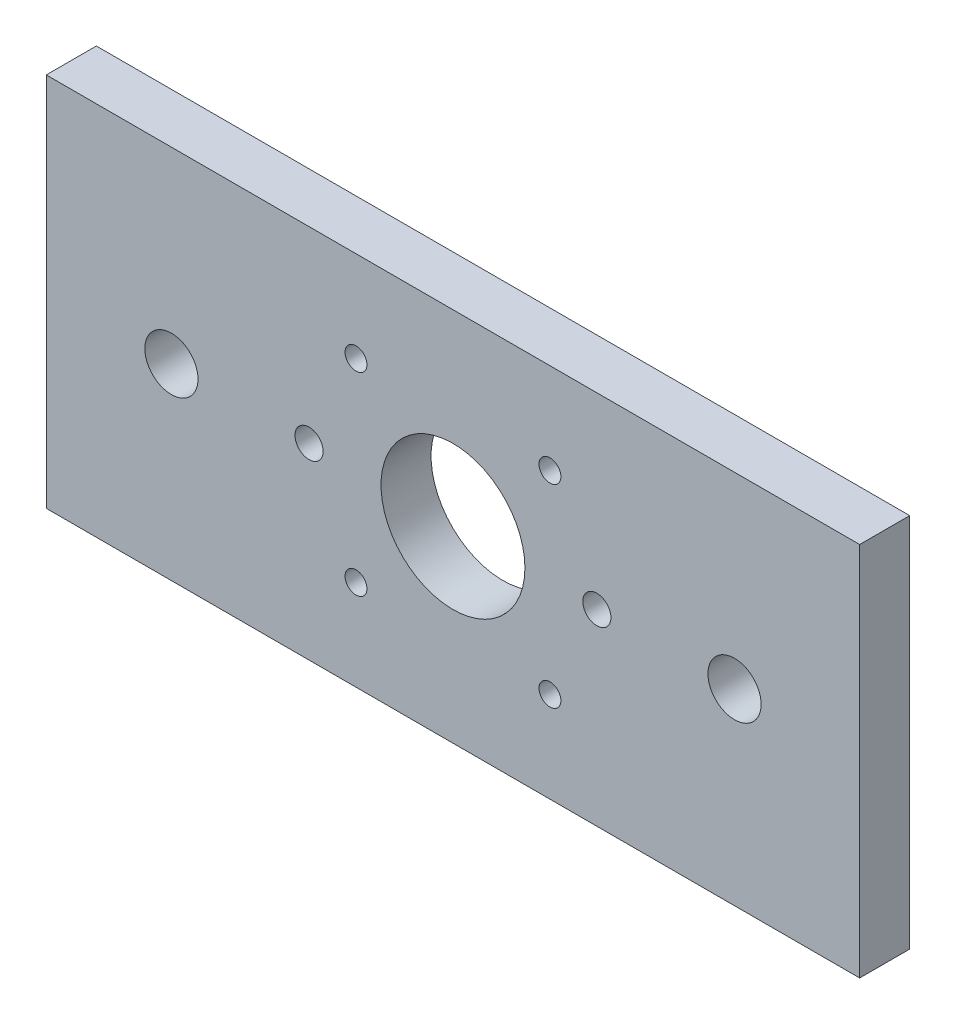
ISO-10303-21;
HEADER;
FILE_DESCRIPTION(('STEP AP214'),'2;1');
FILE_NAME('part.step','',(''),(''),'','','');
FILE_SCHEMA(('AUTOMOTIVE_DESIGN { 1 0 10303 214 1 1 1 1 }'));
ENDSEC;
DATA;
#1=APPLICATION_CONTEXT('core data for automotive mechanical design processes');
#2=APPLICATION_PROTOCOL_DEFINITION('international standard','automotive_design',2000,#1);
#3=PRODUCT_CONTEXT('',#1,'mechanical');
#4=PRODUCT('Part','Part','',(#3));
#5=PRODUCT_RELATED_PRODUCT_CATEGORY('part','',(#4));
#6=PRODUCT_DEFINITION_FORMATION('','',#4);
#7=PRODUCT_DEFINITION_CONTEXT('part definition',#1,'design');
#8=PRODUCT_DEFINITION('design','',#6,#7);
#9=PRODUCT_DEFINITION_SHAPE('','',#8);
#10=(LENGTH_UNIT() NAMED_UNIT(*) SI_UNIT(.MILLI.,.METRE.));
#11=(NAMED_UNIT(*) PLANE_ANGLE_UNIT() SI_UNIT($,.RADIAN.));
#12=(NAMED_UNIT(*) SI_UNIT($,.STERADIAN.) SOLID_ANGLE_UNIT());
#13=UNCERTAINTY_MEASURE_WITH_UNIT(LENGTH_MEASURE(1.E-05),#10,'distance_accuracy_value','');
#14=(GEOMETRIC_REPRESENTATION_CONTEXT(3) GLOBAL_UNCERTAINTY_ASSIGNED_CONTEXT((#13)) GLOBAL_UNIT_ASSIGNED_CONTEXT((#10,
#11,#12)) REPRESENTATION_CONTEXT('',''));
#15=CARTESIAN_POINT('',(0.,0.,0.));
#16=DIRECTION('',(0.,0.,1.));
#17=DIRECTION('',(1.,0.,0.));
#18=AXIS2_PLACEMENT_3D('',#15,#16,#17);
#19=CARTESIAN_POINT('',(15.5,15.5,-1.));
#20=DIRECTION('',(0.,0.,1.));
#21=DIRECTION('',(1.,0.,0.));
#22=AXIS2_PLACEMENT_3D('',#19,#20,#21);
#23=CYLINDRICAL_SURFACE('',#22,1.75);
#24=CARTESIAN_POINT('',(15.5,15.5,8.));
#25=DIRECTION('',(0.,0.,1.));
#26=DIRECTION('',(1.,0.,0.));
#27=AXIS2_PLACEMENT_3D('',#24,#25,#26);
#28=CIRCLE('',#27,1.75);
#29=CARTESIAN_POINT('',(17.25,15.5,8.));
#30=VERTEX_POINT('',#29);
#31=EDGE_CURVE('E147',#30,#30,#28,.T.);
#32=ORIENTED_EDGE('',*,*,#31,.T.);
#33=EDGE_LOOP('',(#32));
#34=FACE_BOUND('',#33,.T.);
#35=CARTESIAN_POINT('',(15.5,15.5,0.));
#36=DIRECTION('',(0.,0.,1.));
#37=DIRECTION('',(1.,0.,0.));
#38=AXIS2_PLACEMENT_3D('',#35,#36,#37);
#39=CIRCLE('',#38,1.75);
#40=CARTESIAN_POINT('',(17.25,15.5,0.));
#41=VERTEX_POINT('',#40);
#42=EDGE_CURVE('E10',#41,#41,#39,.T.);
#43=ORIENTED_EDGE('',*,*,#42,.F.);
#44=EDGE_LOOP('',(#43));
#45=FACE_BOUND('',#44,.T.);
#46=ADVANCED_FACE('F16',(#34,#45),#23,.F.);
#47=CARTESIAN_POINT('',(45.,0.,-1.));
#48=DIRECTION('',(0.,0.,1.));
#49=DIRECTION('',(1.,0.,0.));
#50=AXIS2_PLACEMENT_3D('',#47,#48,#49);
#51=CYLINDRICAL_SURFACE('',#50,4.25);
#52=CARTESIAN_POINT('',(45.,0.,8.));
#53=DIRECTION('',(0.,0.,1.));
#54=DIRECTION('',(1.,0.,0.));
#55=AXIS2_PLACEMENT_3D('',#52,#53,#54);
#56=CIRCLE('',#55,4.25);
#57=CARTESIAN_POINT('',(49.25,0.,8.));
#58=VERTEX_POINT('',#57);
#59=EDGE_CURVE('E137',#58,#58,#56,.T.);
#60=ORIENTED_EDGE('',*,*,#59,.T.);
#61=EDGE_LOOP('',(#60));
#62=FACE_BOUND('',#61,.T.);
#63=CARTESIAN_POINT('',(45.,0.,0.));
#64=DIRECTION('',(0.,0.,1.));
#65=DIRECTION('',(1.,0.,0.));
#66=AXIS2_PLACEMENT_3D('',#63,#64,#65);
#67=CIRCLE('',#66,4.25);
#68=CARTESIAN_POINT('',(49.25,0.,0.));
#69=VERTEX_POINT('',#68);
#70=EDGE_CURVE('E24',#69,#69,#67,.T.);
#71=ORIENTED_EDGE('',*,*,#70,.F.);
#72=EDGE_LOOP('',(#71));
#73=FACE_BOUND('',#72,.T.);
#74=ADVANCED_FACE('F192',(#62,#73),#51,.F.);
#75=CARTESIAN_POINT('',(23.,0.,-1.));
#76=DIRECTION('',(0.,0.,1.));
#77=DIRECTION('',(1.,0.,0.));
#78=AXIS2_PLACEMENT_3D('',#75,#76,#77);
#79=CYLINDRICAL_SURFACE('',#78,2.25);
#80=CARTESIAN_POINT('',(23.,0.,8.));
#81=DIRECTION('',(0.,0.,1.));
#82=DIRECTION('',(1.,0.,0.));
#83=AXIS2_PLACEMENT_3D('',#80,#81,#82);
#84=CIRCLE('',#83,2.25);
#85=CARTESIAN_POINT('',(25.25,0.,8.));
#86=VERTEX_POINT('',#85);
#87=EDGE_CURVE('E124',#86,#86,#84,.T.);
#88=ORIENTED_EDGE('',*,*,#87,.T.);
#89=EDGE_LOOP('',(#88));
#90=FACE_BOUND('',#89,.T.);
#91=CARTESIAN_POINT('',(23.,0.,0.));
#92=DIRECTION('',(0.,0.,1.));
#93=DIRECTION('',(1.,0.,0.));
#94=AXIS2_PLACEMENT_3D('',#91,#92,#93);
#95=CIRCLE('',#94,2.25);
#96=CARTESIAN_POINT('',(25.25,0.,0.));
#97=VERTEX_POINT('',#96);
#98=EDGE_CURVE('E181',#97,#97,#95,.T.);
#99=ORIENTED_EDGE('',*,*,#98,.F.);
#100=EDGE_LOOP('',(#99));
#101=FACE_BOUND('',#100,.T.);
#102=ADVANCED_FACE('F194',(#90,#101),#79,.F.);
#103=CARTESIAN_POINT('',(-15.5,15.5,-1.));
#104=DIRECTION('',(0.,0.,1.));
#105=DIRECTION('',(1.,0.,0.));
#106=AXIS2_PLACEMENT_3D('',#103,#104,#105);
#107=CYLINDRICAL_SURFACE('',#106,1.75);
#108=CARTESIAN_POINT('',(-15.5,15.5,8.));
#109=DIRECTION('',(0.,0.,1.));
#110=DIRECTION('',(1.,0.,0.));
#111=AXIS2_PLACEMENT_3D('',#108,#109,#110);
#112=CIRCLE('',#111,1.75);
#113=CARTESIAN_POINT('',(-13.75,15.5,8.));
#114=VERTEX_POINT('',#113);
#115=EDGE_CURVE('E107',#114,#114,#112,.T.);
#116=ORIENTED_EDGE('',*,*,#115,.T.);
#117=EDGE_LOOP('',(#116));
#118=FACE_BOUND('',#117,.T.);
#119=CARTESIAN_POINT('',(-15.5,15.5,0.));
#120=DIRECTION('',(0.,0.,1.));
#121=DIRECTION('',(1.,0.,0.));
#122=AXIS2_PLACEMENT_3D('',#119,#120,#121);
#123=CIRCLE('',#122,1.75);
#124=CARTESIAN_POINT('',(-13.75,15.5,0.));
#125=VERTEX_POINT('',#124);
#126=EDGE_CURVE('E177',#125,#125,#123,.T.);
#127=ORIENTED_EDGE('',*,*,#126,.F.);
#128=EDGE_LOOP('',(#127));
#129=FACE_BOUND('',#128,.T.);
#130=ADVANCED_FACE('F201',(#118,#129),#107,.F.);
#131=CARTESIAN_POINT('',(0.,0.,-1.));
#132=DIRECTION('',(0.,0.,1.));
#133=DIRECTION('',(1.,0.,0.));
#134=AXIS2_PLACEMENT_3D('',#131,#132,#133);
#135=CYLINDRICAL_SURFACE('',#134,11.5);
#136=CARTESIAN_POINT('',(0.,0.,8.));
#137=DIRECTION('',(0.,0.,1.));
#138=DIRECTION('',(1.,0.,0.));
#139=AXIS2_PLACEMENT_3D('',#136,#137,#138);
#140=CIRCLE('',#139,11.5);
#141=CARTESIAN_POINT('',(11.5,0.,8.));
#142=VERTEX_POINT('',#141);
#143=EDGE_CURVE('E105',#142,#142,#140,.T.);
#144=ORIENTED_EDGE('',*,*,#143,.T.);
#145=EDGE_LOOP('',(#144));
#146=FACE_BOUND('',#145,.T.);
#147=CARTESIAN_POINT('',(0.,0.,0.));
#148=DIRECTION('',(0.,0.,1.));
#149=DIRECTION('',(1.,0.,0.));
#150=AXIS2_PLACEMENT_3D('',#147,#148,#149);
#151=CIRCLE('',#150,11.5);
#152=CARTESIAN_POINT('',(11.5,0.,0.));
#153=VERTEX_POINT('',#152);
#154=EDGE_CURVE('E173',#153,#153,#151,.T.);
#155=ORIENTED_EDGE('',*,*,#154,.F.);
#156=EDGE_LOOP('',(#155));
#157=FACE_BOUND('',#156,.T.);
#158=ADVANCED_FACE('F208',(#146,#157),#135,.F.);
#159=CARTESIAN_POINT('',(-23.,0.,-1.));
#160=DIRECTION('',(0.,0.,1.));
#161=DIRECTION('',(1.,0.,0.));
#162=AXIS2_PLACEMENT_3D('',#159,#160,#161);
#163=CYLINDRICAL_SURFACE('',#162,2.25);
#164=CARTESIAN_POINT('',(-23.,0.,8.));
#165=DIRECTION('',(0.,0.,1.));
#166=DIRECTION('',(1.,0.,0.));
#167=AXIS2_PLACEMENT_3D('',#164,#165,#166);
#168=CIRCLE('',#167,2.25);
#169=CARTESIAN_POINT('',(-20.75,0.,8.));
#170=VERTEX_POINT('',#169);
#171=EDGE_CURVE('E108',#170,#170,#168,.T.);
#172=ORIENTED_EDGE('',*,*,#171,.T.);
#173=EDGE_LOOP('',(#172));
#174=FACE_BOUND('',#173,.T.);
#175=CARTESIAN_POINT('',(-23.,0.,0.));
#176=DIRECTION('',(0.,0.,1.));
#177=DIRECTION('',(1.,0.,0.));
#178=AXIS2_PLACEMENT_3D('',#175,#176,#177);
#179=CIRCLE('',#178,2.25);
#180=CARTESIAN_POINT('',(-20.75,0.,0.));
#181=VERTEX_POINT('',#180);
#182=EDGE_CURVE('E169',#181,#181,#179,.T.);
#183=ORIENTED_EDGE('',*,*,#182,.F.);
#184=EDGE_LOOP('',(#183));
#185=FACE_BOUND('',#184,.T.);
#186=ADVANCED_FACE('F210',(#174,#185),#163,.F.);
#187=CARTESIAN_POINT('',(-45.,0.,-1.));
#188=DIRECTION('',(0.,0.,1.));
#189=DIRECTION('',(1.,0.,0.));
#190=AXIS2_PLACEMENT_3D('',#187,#188,#189);
#191=CYLINDRICAL_SURFACE('',#190,4.25);
#192=CARTESIAN_POINT('',(-45.,0.,8.));
#193=DIRECTION('',(0.,0.,1.));
#194=DIRECTION('',(1.,0.,0.));
#195=AXIS2_PLACEMENT_3D('',#192,#193,#194);
#196=CIRCLE('',#195,4.25);
#197=CARTESIAN_POINT('',(-40.75,0.,8.));
#198=VERTEX_POINT('',#197);
#199=EDGE_CURVE('E116',#198,#198,#196,.T.);
#200=ORIENTED_EDGE('',*,*,#199,.T.);
#201=EDGE_LOOP('',(#200));
#202=FACE_BOUND('',#201,.T.);
#203=CARTESIAN_POINT('',(-45.,0.,0.));
#204=DIRECTION('',(0.,0.,1.));
#205=DIRECTION('',(1.,0.,0.));
#206=AXIS2_PLACEMENT_3D('',#203,#204,#205);
#207=CIRCLE('',#206,4.25);
#208=CARTESIAN_POINT('',(-40.75,0.,0.));
#209=VERTEX_POINT('',#208);
#210=EDGE_CURVE('E165',#209,#209,#207,.T.);
#211=ORIENTED_EDGE('',*,*,#210,.F.);
#212=EDGE_LOOP('',(#211));
#213=FACE_BOUND('',#212,.T.);
#214=ADVANCED_FACE('F213',(#202,#213),#191,.F.);
#215=CARTESIAN_POINT('',(15.5,-15.5,-1.));
#216=DIRECTION('',(0.,0.,1.));
#217=DIRECTION('',(1.,0.,0.));
#218=AXIS2_PLACEMENT_3D('',#215,#216,#217);
#219=CYLINDRICAL_SURFACE('',#218,1.75);
#220=CARTESIAN_POINT('',(15.5,-15.5,8.));
#221=DIRECTION('',(0.,0.,1.));
#222=DIRECTION('',(1.,0.,0.));
#223=AXIS2_PLACEMENT_3D('',#220,#221,#222);
#224=CIRCLE('',#223,1.75);
#225=CARTESIAN_POINT('',(17.25,-15.5,8.));
#226=VERTEX_POINT('',#225);
#227=EDGE_CURVE('E133',#226,#226,#224,.T.);
#228=ORIENTED_EDGE('',*,*,#227,.T.);
#229=EDGE_LOOP('',(#228));
#230=FACE_BOUND('',#229,.T.);
#231=CARTESIAN_POINT('',(15.5,-15.5,0.));
#232=DIRECTION('',(0.,0.,1.));
#233=DIRECTION('',(1.,0.,0.));
#234=AXIS2_PLACEMENT_3D('',#231,#232,#233);
#235=CIRCLE('',#234,1.75);
#236=CARTESIAN_POINT('',(17.25,-15.5,0.));
#237=VERTEX_POINT('',#236);
#238=EDGE_CURVE('E161',#237,#237,#235,.T.);
#239=ORIENTED_EDGE('',*,*,#238,.F.);
#240=EDGE_LOOP('',(#239));
#241=FACE_BOUND('',#240,.T.);
#242=ADVANCED_FACE('F215',(#230,#241),#219,.F.);
#243=CARTESIAN_POINT('',(-15.5,-15.5,-1.));
#244=DIRECTION('',(0.,0.,1.));
#245=DIRECTION('',(1.,0.,0.));
#246=AXIS2_PLACEMENT_3D('',#243,#244,#245);
#247=CYLINDRICAL_SURFACE('',#246,1.75);
#248=CARTESIAN_POINT('',(-15.5,-15.5,8.));
#249=DIRECTION('',(0.,0.,1.));
#250=DIRECTION('',(1.,0.,0.));
#251=AXIS2_PLACEMENT_3D('',#248,#249,#250);
#252=CIRCLE('',#251,1.75);
#253=CARTESIAN_POINT('',(-13.75,-15.5,8.));
#254=VERTEX_POINT('',#253);
#255=EDGE_CURVE('E127',#254,#254,#252,.T.);
#256=ORIENTED_EDGE('',*,*,#255,.T.);
#257=EDGE_LOOP('',(#256));
#258=FACE_BOUND('',#257,.T.);
#259=CARTESIAN_POINT('',(-15.5,-15.5,0.));
#260=DIRECTION('',(0.,0.,1.));
#261=DIRECTION('',(1.,0.,0.));
#262=AXIS2_PLACEMENT_3D('',#259,#260,#261);
#263=CIRCLE('',#262,1.75);
#264=CARTESIAN_POINT('',(-13.75,-15.5,0.));
#265=VERTEX_POINT('',#264);
#266=EDGE_CURVE('E157',#265,#265,#263,.T.);
#267=ORIENTED_EDGE('',*,*,#266,.F.);
#268=EDGE_LOOP('',(#267));
#269=FACE_BOUND('',#268,.T.);
#270=ADVANCED_FACE('F218',(#258,#269),#247,.F.);
#271=CARTESIAN_POINT('',(65.,-30.,0.));
#272=DIRECTION('',(1.,0.,0.));
#273=DIRECTION('',(0.,1.,0.));
#274=AXIS2_PLACEMENT_3D('',#271,#272,#273);
#275=PLANE('',#274);
#276=DIRECTION('',(0.,0.,1.));
#277=VECTOR('',#276,1.);
#278=CARTESIAN_POINT('',(65.,-30.,0.));
#279=LINE('',#278,#277);
#280=CARTESIAN_POINT('',(65.,-30.,0.));
#281=VERTEX_POINT('',#280);
#282=CARTESIAN_POINT('',(65.,-30.,8.));
#283=VERTEX_POINT('',#282);
#284=EDGE_CURVE('E76',#281,#283,#279,.T.);
#285=ORIENTED_EDGE('',*,*,#284,.F.);
#286=DIRECTION('',(0.,1.,0.));
#287=VECTOR('',#286,1.);
#288=CARTESIAN_POINT('',(65.,-30.,0.));
#289=LINE('',#288,#287);
#290=CARTESIAN_POINT('',(65.,30.,0.));
#291=VERTEX_POINT('',#290);
#292=EDGE_CURVE('E36',#281,#291,#289,.T.);
#293=ORIENTED_EDGE('',*,*,#292,.T.);
#294=DIRECTION('',(0.,0.,1.));
#295=VECTOR('',#294,1.);
#296=CARTESIAN_POINT('',(65.,30.,0.));
#297=LINE('',#296,#295);
#298=CARTESIAN_POINT('',(65.,30.,8.));
#299=VERTEX_POINT('',#298);
#300=EDGE_CURVE('E42',#291,#299,#297,.T.);
#301=ORIENTED_EDGE('',*,*,#300,.T.);
#302=DIRECTION('',(0.,1.,0.));
#303=VECTOR('',#302,1.);
#304=CARTESIAN_POINT('',(65.,-30.,8.));
#305=LINE('',#304,#303);
#306=EDGE_CURVE('E118',#283,#299,#305,.T.);
#307=ORIENTED_EDGE('',*,*,#306,.F.);
#308=EDGE_LOOP('',(#285,#293,#301,#307));
#309=FACE_BOUND('',#308,.T.);
#310=ADVANCED_FACE('F228',(#309),#275,.T.);
#311=CARTESIAN_POINT('',(-65.,-30.,0.));
#312=DIRECTION('',(0.,0.,1.));
#313=DIRECTION('',(1.,0.,0.));
#314=AXIS2_PLACEMENT_3D('',#311,#312,#313);
#315=PLANE('',#314);
#316=ORIENTED_EDGE('',*,*,#42,.T.);
#317=EDGE_LOOP('',(#316));
#318=FACE_BOUND('',#317,.T.);
#319=ORIENTED_EDGE('',*,*,#70,.T.);
#320=EDGE_LOOP('',(#319));
#321=FACE_BOUND('',#320,.T.);
#322=ORIENTED_EDGE('',*,*,#98,.T.);
#323=EDGE_LOOP('',(#322));
#324=FACE_BOUND('',#323,.T.);
#325=ORIENTED_EDGE('',*,*,#126,.T.);
#326=EDGE_LOOP('',(#325));
#327=FACE_BOUND('',#326,.T.);
#328=ORIENTED_EDGE('',*,*,#154,.T.);
#329=EDGE_LOOP('',(#328));
#330=FACE_BOUND('',#329,.T.);
#331=ORIENTED_EDGE('',*,*,#182,.T.);
#332=EDGE_LOOP('',(#331));
#333=FACE_BOUND('',#332,.T.);
#334=ORIENTED_EDGE('',*,*,#210,.T.);
#335=EDGE_LOOP('',(#334));
#336=FACE_BOUND('',#335,.T.);
#337=ORIENTED_EDGE('',*,*,#238,.T.);
#338=EDGE_LOOP('',(#337));
#339=FACE_BOUND('',#338,.T.);
#340=ORIENTED_EDGE('',*,*,#266,.T.);
#341=EDGE_LOOP('',(#340));
#342=FACE_BOUND('',#341,.T.);
#343=DIRECTION('',(1.,0.,0.));
#344=VECTOR('',#343,1.);
#345=CARTESIAN_POINT('',(-65.,30.,0.));
#346=LINE('',#345,#344);
#347=CARTESIAN_POINT('',(-65.,30.,0.));
#348=VERTEX_POINT('',#347);
#349=EDGE_CURVE('E151',#348,#291,#346,.T.);
#350=ORIENTED_EDGE('',*,*,#349,.T.);
#351=ORIENTED_EDGE('',*,*,#292,.F.);
#352=DIRECTION('',(1.,0.,0.));
#353=VECTOR('',#352,1.);
#354=CARTESIAN_POINT('',(-65.,-30.,0.));
#355=LINE('',#354,#353);
#356=CARTESIAN_POINT('',(-65.,-30.,0.));
#357=VERTEX_POINT('',#356);
#358=EDGE_CURVE('E81',#357,#281,#355,.T.);
#359=ORIENTED_EDGE('',*,*,#358,.F.);
#360=DIRECTION('',(0.,1.,0.));
#361=VECTOR('',#360,1.);
#362=CARTESIAN_POINT('',(-65.,-30.,0.));
#363=LINE('',#362,#361);
#364=EDGE_CURVE('E89',#357,#348,#363,.T.);
#365=ORIENTED_EDGE('',*,*,#364,.T.);
#366=EDGE_LOOP('',(#350,#351,#359,#365));
#367=FACE_BOUND('',#366,.T.);
#368=ADVANCED_FACE('F189',(#318,#321,#324,#327,#330,#333,#336,#339,#342,#367),#315,.F.);
#369=CARTESIAN_POINT('',(-65.,30.,0.));
#370=DIRECTION('',(0.,1.,0.));
#371=DIRECTION('',(1.,0.,0.));
#372=AXIS2_PLACEMENT_3D('',#369,#370,#371);
#373=PLANE('',#372);
#374=ORIENTED_EDGE('',*,*,#349,.F.);
#375=DIRECTION('',(0.,0.,1.));
#376=VECTOR('',#375,1.);
#377=CARTESIAN_POINT('',(-65.,30.,0.));
#378=LINE('',#377,#376);
#379=CARTESIAN_POINT('',(-65.,30.,8.));
#380=VERTEX_POINT('',#379);
#381=EDGE_CURVE('E96',#348,#380,#378,.T.);
#382=ORIENTED_EDGE('',*,*,#381,.T.);
#383=DIRECTION('',(1.,0.,0.));
#384=VECTOR('',#383,1.);
#385=CARTESIAN_POINT('',(-65.,30.,8.));
#386=LINE('',#385,#384);
#387=EDGE_CURVE('E93',#380,#299,#386,.T.);
#388=ORIENTED_EDGE('',*,*,#387,.T.);
#389=ORIENTED_EDGE('',*,*,#300,.F.);
#390=EDGE_LOOP('',(#374,#382,#388,#389));
#391=FACE_BOUND('',#390,.T.);
#392=ADVANCED_FACE('F234',(#391),#373,.T.);
#393=CARTESIAN_POINT('',(-65.,-30.,8.));
#394=DIRECTION('',(0.,0.,1.));
#395=DIRECTION('',(1.,0.,0.));
#396=AXIS2_PLACEMENT_3D('',#393,#394,#395);
#397=PLANE('',#396);
#398=ORIENTED_EDGE('',*,*,#31,.F.);
#399=EDGE_LOOP('',(#398));
#400=FACE_BOUND('',#399,.T.);
#401=ORIENTED_EDGE('',*,*,#59,.F.);
#402=EDGE_LOOP('',(#401));
#403=FACE_BOUND('',#402,.T.);
#404=ORIENTED_EDGE('',*,*,#87,.F.);
#405=EDGE_LOOP('',(#404));
#406=FACE_BOUND('',#405,.T.);
#407=ORIENTED_EDGE('',*,*,#115,.F.);
#408=EDGE_LOOP('',(#407));
#409=FACE_BOUND('',#408,.T.);
#410=ORIENTED_EDGE('',*,*,#143,.F.);
#411=EDGE_LOOP('',(#410));
#412=FACE_BOUND('',#411,.T.);
#413=ORIENTED_EDGE('',*,*,#171,.F.);
#414=EDGE_LOOP('',(#413));
#415=FACE_BOUND('',#414,.T.);
#416=ORIENTED_EDGE('',*,*,#199,.F.);
#417=EDGE_LOOP('',(#416));
#418=FACE_BOUND('',#417,.T.);
#419=ORIENTED_EDGE('',*,*,#227,.F.);
#420=EDGE_LOOP('',(#419));
#421=FACE_BOUND('',#420,.T.);
#422=ORIENTED_EDGE('',*,*,#255,.F.);
#423=EDGE_LOOP('',(#422));
#424=FACE_BOUND('',#423,.T.);
#425=DIRECTION('',(0.,1.,0.));
#426=VECTOR('',#425,1.);
#427=CARTESIAN_POINT('',(-65.,-30.,8.));
#428=LINE('',#427,#426);
#429=CARTESIAN_POINT('',(-65.,-30.,8.));
#430=VERTEX_POINT('',#429);
#431=EDGE_CURVE('E87',#430,#380,#428,.T.);
#432=ORIENTED_EDGE('',*,*,#431,.F.);
#433=DIRECTION('',(1.,0.,0.));
#434=VECTOR('',#433,1.);
#435=CARTESIAN_POINT('',(-65.,-30.,8.));
#436=LINE('',#435,#434);
#437=EDGE_CURVE('E70',#430,#283,#436,.T.);
#438=ORIENTED_EDGE('',*,*,#437,.T.);
#439=ORIENTED_EDGE('',*,*,#306,.T.);
#440=ORIENTED_EDGE('',*,*,#387,.F.);
#441=EDGE_LOOP('',(#432,#438,#439,#440));
#442=FACE_BOUND('',#441,.T.);
#443=ADVANCED_FACE('F92',(#400,#403,#406,#409,#412,#415,#418,#421,#424,#442),#397,.T.);
#444=CARTESIAN_POINT('',(-65.,-30.,0.));
#445=DIRECTION('',(0.,1.,0.));
#446=DIRECTION('',(1.,0.,0.));
#447=AXIS2_PLACEMENT_3D('',#444,#445,#446);
#448=PLANE('',#447);
#449=ORIENTED_EDGE('',*,*,#284,.T.);
#450=ORIENTED_EDGE('',*,*,#437,.F.);
#451=DIRECTION('',(0.,0.,1.));
#452=VECTOR('',#451,1.);
#453=CARTESIAN_POINT('',(-65.,-30.,0.));
#454=LINE('',#453,#452);
#455=EDGE_CURVE('E74',#357,#430,#454,.T.);
#456=ORIENTED_EDGE('',*,*,#455,.F.);
#457=ORIENTED_EDGE('',*,*,#358,.T.);
#458=EDGE_LOOP('',(#449,#450,#456,#457));
#459=FACE_BOUND('',#458,.T.);
#460=ADVANCED_FACE('F72',(#459),#448,.F.);
#461=CARTESIAN_POINT('',(-65.,-30.,0.));
#462=DIRECTION('',(1.,0.,0.));
#463=DIRECTION('',(0.,1.,0.));
#464=AXIS2_PLACEMENT_3D('',#461,#462,#463);
#465=PLANE('',#464);
#466=ORIENTED_EDGE('',*,*,#431,.T.);
#467=ORIENTED_EDGE('',*,*,#381,.F.);
#468=ORIENTED_EDGE('',*,*,#364,.F.);
#469=ORIENTED_EDGE('',*,*,#455,.T.);
#470=EDGE_LOOP('',(#466,#467,#468,#469));
#471=FACE_BOUND('',#470,.T.);
#472=ADVANCED_FACE('F85',(#471),#465,.F.);
#473=CLOSED_SHELL('',(#46,#74,#102,#130,#158,#186,#214,#242,#270,#310,#368,#392,#443,#460,#472));
#474=MANIFOLD_SOLID_BREP('B1',#473);
#475=ADVANCED_BREP_SHAPE_REPRESENTATION('',(#18,#474),#14);
#476=SHAPE_DEFINITION_REPRESENTATION(#9,#475);
ENDSEC;
END-ISO-10303-21;
